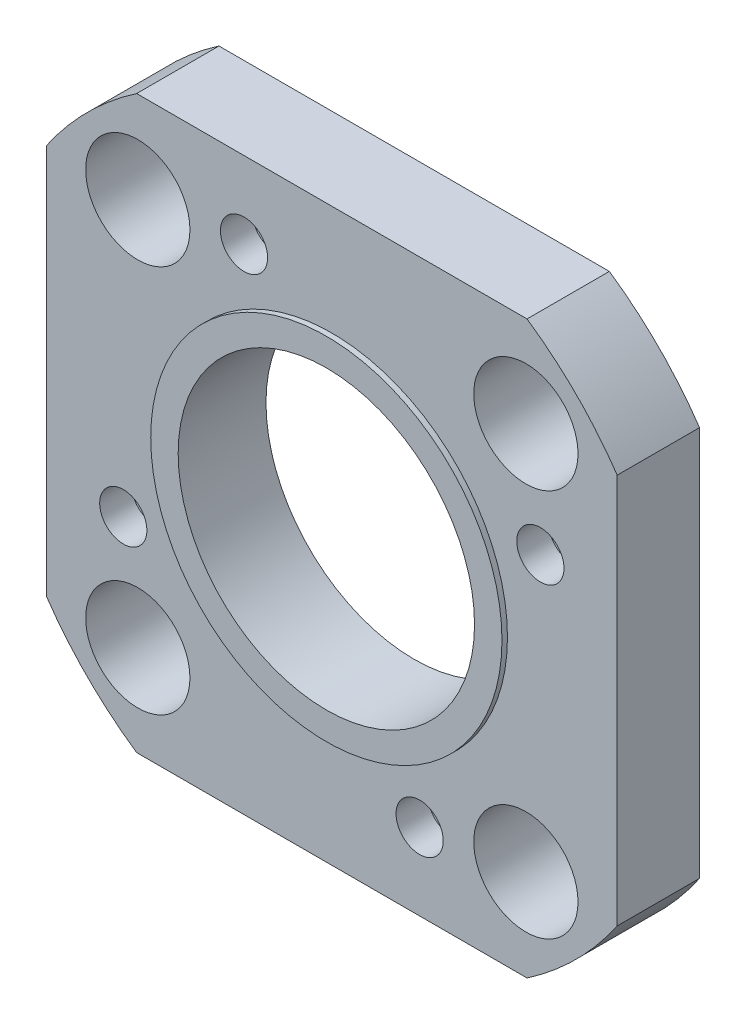
ISO-10303-21;
HEADER;
FILE_DESCRIPTION(('STEP AP214'),'2;1');
FILE_NAME('part.step','',(''),(''),'','','');
FILE_SCHEMA(('AUTOMOTIVE_DESIGN { 1 0 10303 214 1 1 1 1 }'));
ENDSEC;
DATA;
#1=APPLICATION_CONTEXT('core data for automotive mechanical design processes');
#2=APPLICATION_PROTOCOL_DEFINITION('international standard','automotive_design',2000,#1);
#3=PRODUCT_CONTEXT('',#1,'mechanical');
#4=PRODUCT('Part','Part','',(#3));
#5=PRODUCT_RELATED_PRODUCT_CATEGORY('part','',(#4));
#6=PRODUCT_DEFINITION_FORMATION('','',#4);
#7=PRODUCT_DEFINITION_CONTEXT('part definition',#1,'design');
#8=PRODUCT_DEFINITION('design','',#6,#7);
#9=PRODUCT_DEFINITION_SHAPE('','',#8);
#10=(LENGTH_UNIT() NAMED_UNIT(*) SI_UNIT(.MILLI.,.METRE.));
#11=(NAMED_UNIT(*) PLANE_ANGLE_UNIT() SI_UNIT($,.RADIAN.));
#12=(NAMED_UNIT(*) SI_UNIT($,.STERADIAN.) SOLID_ANGLE_UNIT());
#13=UNCERTAINTY_MEASURE_WITH_UNIT(LENGTH_MEASURE(1.E-05),#10,'distance_accuracy_value','');
#14=(GEOMETRIC_REPRESENTATION_CONTEXT(3) GLOBAL_UNCERTAINTY_ASSIGNED_CONTEXT((#13)) GLOBAL_UNIT_ASSIGNED_CONTEXT((#10,
#11,#12)) REPRESENTATION_CONTEXT('',''));
#15=CARTESIAN_POINT('',(0.,0.,0.));
#16=DIRECTION('',(0.,0.,1.));
#17=DIRECTION('',(1.,0.,0.));
#18=AXIS2_PLACEMENT_3D('',#15,#16,#17);
#19=CARTESIAN_POINT('',(19.,8.,0.));
#20=DIRECTION('',(0.,0.,1.));
#21=DIRECTION('',(-1.,0.,0.));
#22=AXIS2_PLACEMENT_3D('',#19,#20,#21);
#23=CYLINDRICAL_SURFACE('',#22,4.);
#24=CARTESIAN_POINT('',(19.,8.,0.));
#25=DIRECTION('',(0.,0.,-1.));
#26=DIRECTION('',(-1.,0.,0.));
#27=AXIS2_PLACEMENT_3D('',#24,#25,#26);
#28=CIRCLE('',#27,4.);
#29=CARTESIAN_POINT('',(23.,8.,0.));
#30=VERTEX_POINT('',#29);
#31=EDGE_CURVE('E170',#30,#30,#28,.T.);
#32=ORIENTED_EDGE('',*,*,#31,.T.);
#33=DIRECTION('',(0.,0.,1.));
#34=VECTOR('',#33,1.);
#35=CARTESIAN_POINT('',(23.,8.,0.));
#36=LINE('',#35,#34);
#37=CARTESIAN_POINT('',(23.,8.,4.6));
#38=VERTEX_POINT('',#37);
#39=EDGE_CURVE('E11',#30,#38,#36,.T.);
#40=ORIENTED_EDGE('',*,*,#39,.T.);
#41=CARTESIAN_POINT('',(19.,8.,4.6));
#42=DIRECTION('',(0.,0.,-1.));
#43=DIRECTION('',(-1.,0.,0.));
#44=AXIS2_PLACEMENT_3D('',#41,#42,#43);
#45=CIRCLE('',#44,4.);
#46=EDGE_CURVE('E27',#38,#38,#45,.T.);
#47=ORIENTED_EDGE('',*,*,#46,.F.);
#48=ORIENTED_EDGE('',*,*,#39,.F.);
#49=EDGE_LOOP('',(#32,#40,#47,#48));
#50=FACE_BOUND('',#49,.T.);
#51=ADVANCED_FACE('F17',(#50),#23,.F.);
#52=CARTESIAN_POINT('',(16.85,8.,4.6));
#53=DIRECTION('',(0.,0.,-1.));
#54=DIRECTION('',(0.,-1.,0.));
#55=AXIS2_PLACEMENT_3D('',#52,#53,#54);
#56=PLANE('',#55);
#57=CARTESIAN_POINT('',(19.,8.,4.6));
#58=DIRECTION('',(0.,0.,-1.));
#59=DIRECTION('',(-1.,0.,0.));
#60=AXIS2_PLACEMENT_3D('',#57,#58,#59);
#61=CIRCLE('',#60,2.15);
#62=CARTESIAN_POINT('',(21.15,8.,4.6));
#63=VERTEX_POINT('',#62);
#64=EDGE_CURVE('E145',#63,#63,#61,.T.);
#65=ORIENTED_EDGE('',*,*,#64,.F.);
#66=EDGE_LOOP('',(#65));
#67=FACE_BOUND('',#66,.T.);
#68=ORIENTED_EDGE('',*,*,#46,.T.);
#69=EDGE_LOOP('',(#68));
#70=FACE_BOUND('',#69,.T.);
#71=ADVANCED_FACE('F164',(#67,#70),#56,.T.);
#72=CARTESIAN_POINT('',(19.,8.,0.));
#73=DIRECTION('',(0.,0.,1.));
#74=DIRECTION('',(-1.,0.,0.));
#75=AXIS2_PLACEMENT_3D('',#72,#73,#74);
#76=CYLINDRICAL_SURFACE('',#75,2.15);
#77=ORIENTED_EDGE('',*,*,#64,.T.);
#78=DIRECTION('',(0.,0.,1.));
#79=VECTOR('',#78,1.);
#80=CARTESIAN_POINT('',(21.15,8.,0.));
#81=LINE('',#80,#79);
#82=CARTESIAN_POINT('',(21.15,8.,7.5));
#83=VERTEX_POINT('',#82);
#84=EDGE_CURVE('E158',#63,#83,#81,.T.);
#85=ORIENTED_EDGE('',*,*,#84,.T.);
#86=CARTESIAN_POINT('',(19.,8.,7.5));
#87=DIRECTION('',(0.,0.,-1.));
#88=DIRECTION('',(-1.,0.,0.));
#89=AXIS2_PLACEMENT_3D('',#86,#87,#88);
#90=CIRCLE('',#89,2.15);
#91=EDGE_CURVE('E382',#83,#83,#90,.T.);
#92=ORIENTED_EDGE('',*,*,#91,.F.);
#93=ORIENTED_EDGE('',*,*,#84,.F.);
#94=EDGE_LOOP('',(#77,#85,#92,#93));
#95=FACE_BOUND('',#94,.T.);
#96=ADVANCED_FACE('F535',(#95),#76,.F.);
#97=CARTESIAN_POINT('',(8.,-19.,0.));
#98=DIRECTION('',(0.,0.,1.));
#99=DIRECTION('',(-1.,0.,0.));
#100=AXIS2_PLACEMENT_3D('',#97,#98,#99);
#101=CYLINDRICAL_SURFACE('',#100,4.);
#102=CARTESIAN_POINT('',(8.,-19.,0.));
#103=DIRECTION('',(0.,0.,-1.));
#104=DIRECTION('',(-1.,0.,0.));
#105=AXIS2_PLACEMENT_3D('',#102,#103,#104);
#106=CIRCLE('',#105,4.);
#107=CARTESIAN_POINT('',(12.,-19.,0.));
#108=VERTEX_POINT('',#107);
#109=EDGE_CURVE('E142',#108,#108,#106,.T.);
#110=ORIENTED_EDGE('',*,*,#109,.T.);
#111=DIRECTION('',(0.,0.,1.));
#112=VECTOR('',#111,1.);
#113=CARTESIAN_POINT('',(12.,-19.,0.));
#114=LINE('',#113,#112);
#115=CARTESIAN_POINT('',(12.,-19.,4.6));
#116=VERTEX_POINT('',#115);
#117=EDGE_CURVE('E140',#108,#116,#114,.T.);
#118=ORIENTED_EDGE('',*,*,#117,.T.);
#119=CARTESIAN_POINT('',(8.,-19.,4.6));
#120=DIRECTION('',(0.,0.,-1.));
#121=DIRECTION('',(-1.,0.,0.));
#122=AXIS2_PLACEMENT_3D('',#119,#120,#121);
#123=CIRCLE('',#122,4.);
#124=EDGE_CURVE('E139',#116,#116,#123,.T.);
#125=ORIENTED_EDGE('',*,*,#124,.F.);
#126=ORIENTED_EDGE('',*,*,#117,.F.);
#127=EDGE_LOOP('',(#110,#118,#125,#126));
#128=FACE_BOUND('',#127,.T.);
#129=ADVANCED_FACE('F137',(#128),#101,.F.);
#130=CARTESIAN_POINT('',(5.85,-19.,4.6));
#131=DIRECTION('',(0.,0.,-1.));
#132=DIRECTION('',(0.,-1.,0.));
#133=AXIS2_PLACEMENT_3D('',#130,#131,#132);
#134=PLANE('',#133);
#135=CARTESIAN_POINT('',(8.,-19.,4.6));
#136=DIRECTION('',(0.,0.,-1.));
#137=DIRECTION('',(-1.,0.,0.));
#138=AXIS2_PLACEMENT_3D('',#135,#136,#137);
#139=CIRCLE('',#138,2.15);
#140=CARTESIAN_POINT('',(10.15,-19.,4.6));
#141=VERTEX_POINT('',#140);
#142=EDGE_CURVE('E152',#141,#141,#139,.T.);
#143=ORIENTED_EDGE('',*,*,#142,.F.);
#144=EDGE_LOOP('',(#143));
#145=FACE_BOUND('',#144,.T.);
#146=ORIENTED_EDGE('',*,*,#124,.T.);
#147=EDGE_LOOP('',(#146));
#148=FACE_BOUND('',#147,.T.);
#149=ADVANCED_FACE('F150',(#145,#148),#134,.T.);
#150=CARTESIAN_POINT('',(8.,-19.,0.));
#151=DIRECTION('',(0.,0.,1.));
#152=DIRECTION('',(-1.,0.,0.));
#153=AXIS2_PLACEMENT_3D('',#150,#151,#152);
#154=CYLINDRICAL_SURFACE('',#153,2.15);
#155=ORIENTED_EDGE('',*,*,#142,.T.);
#156=DIRECTION('',(0.,0.,1.));
#157=VECTOR('',#156,1.);
#158=CARTESIAN_POINT('',(10.15,-19.,0.));
#159=LINE('',#158,#157);
#160=CARTESIAN_POINT('',(10.15,-19.,7.5));
#161=VERTEX_POINT('',#160);
#162=EDGE_CURVE('E129',#141,#161,#159,.T.);
#163=ORIENTED_EDGE('',*,*,#162,.T.);
#164=CARTESIAN_POINT('',(8.,-19.,7.5));
#165=DIRECTION('',(0.,0.,-1.));
#166=DIRECTION('',(-1.,0.,0.));
#167=AXIS2_PLACEMENT_3D('',#164,#165,#166);
#168=CIRCLE('',#167,2.15);
#169=EDGE_CURVE('E357',#161,#161,#168,.T.);
#170=ORIENTED_EDGE('',*,*,#169,.F.);
#171=ORIENTED_EDGE('',*,*,#162,.F.);
#172=EDGE_LOOP('',(#155,#163,#170,#171));
#173=FACE_BOUND('',#172,.T.);
#174=ADVANCED_FACE('F519',(#173),#154,.F.);
#175=CARTESIAN_POINT('',(-19.,-8.,0.));
#176=DIRECTION('',(0.,0.,1.));
#177=DIRECTION('',(-1.,0.,0.));
#178=AXIS2_PLACEMENT_3D('',#175,#176,#177);
#179=CYLINDRICAL_SURFACE('',#178,4.);
#180=CARTESIAN_POINT('',(-19.,-8.,0.));
#181=DIRECTION('',(0.,0.,-1.));
#182=DIRECTION('',(-1.,0.,0.));
#183=AXIS2_PLACEMENT_3D('',#180,#181,#182);
#184=CIRCLE('',#183,4.);
#185=CARTESIAN_POINT('',(-15.,-8.,0.));
#186=VERTEX_POINT('',#185);
#187=EDGE_CURVE('E177',#186,#186,#184,.T.);
#188=ORIENTED_EDGE('',*,*,#187,.T.);
#189=DIRECTION('',(0.,0.,1.));
#190=VECTOR('',#189,1.);
#191=CARTESIAN_POINT('',(-15.,-8.,0.));
#192=LINE('',#191,#190);
#193=CARTESIAN_POINT('',(-15.,-8.,4.6));
#194=VERTEX_POINT('',#193);
#195=EDGE_CURVE('E248',#186,#194,#192,.T.);
#196=ORIENTED_EDGE('',*,*,#195,.T.);
#197=CARTESIAN_POINT('',(-19.,-8.,4.6));
#198=DIRECTION('',(0.,0.,-1.));
#199=DIRECTION('',(-1.,0.,0.));
#200=AXIS2_PLACEMENT_3D('',#197,#198,#199);
#201=CIRCLE('',#200,4.);
#202=EDGE_CURVE('E253',#194,#194,#201,.T.);
#203=ORIENTED_EDGE('',*,*,#202,.F.);
#204=ORIENTED_EDGE('',*,*,#195,.F.);
#205=EDGE_LOOP('',(#188,#196,#203,#204));
#206=FACE_BOUND('',#205,.T.);
#207=ADVANCED_FACE('F264',(#206),#179,.F.);
#208=CARTESIAN_POINT('',(-21.15,-8.,4.6));
#209=DIRECTION('',(0.,0.,-1.));
#210=DIRECTION('',(0.,-1.,0.));
#211=AXIS2_PLACEMENT_3D('',#208,#209,#210);
#212=PLANE('',#211);
#213=CARTESIAN_POINT('',(-19.,-8.,4.6));
#214=DIRECTION('',(0.,0.,-1.));
#215=DIRECTION('',(-1.,0.,0.));
#216=AXIS2_PLACEMENT_3D('',#213,#214,#215);
#217=CIRCLE('',#216,2.15);
#218=CARTESIAN_POINT('',(-16.85,-8.,4.6));
#219=VERTEX_POINT('',#218);
#220=EDGE_CURVE('E250',#219,#219,#217,.T.);
#221=ORIENTED_EDGE('',*,*,#220,.F.);
#222=EDGE_LOOP('',(#221));
#223=FACE_BOUND('',#222,.T.);
#224=ORIENTED_EDGE('',*,*,#202,.T.);
#225=EDGE_LOOP('',(#224));
#226=FACE_BOUND('',#225,.T.);
#227=ADVANCED_FACE('F263',(#223,#226),#212,.T.);
#228=CARTESIAN_POINT('',(-19.,-8.,0.));
#229=DIRECTION('',(0.,0.,1.));
#230=DIRECTION('',(-1.,0.,0.));
#231=AXIS2_PLACEMENT_3D('',#228,#229,#230);
#232=CYLINDRICAL_SURFACE('',#231,2.15);
#233=ORIENTED_EDGE('',*,*,#220,.T.);
#234=DIRECTION('',(0.,0.,1.));
#235=VECTOR('',#234,1.);
#236=CARTESIAN_POINT('',(-16.85,-8.,0.));
#237=LINE('',#236,#235);
#238=CARTESIAN_POINT('',(-16.85,-8.,7.5));
#239=VERTEX_POINT('',#238);
#240=EDGE_CURVE('E254',#219,#239,#237,.T.);
#241=ORIENTED_EDGE('',*,*,#240,.T.);
#242=CARTESIAN_POINT('',(-19.,-8.,7.5));
#243=DIRECTION('',(0.,0.,-1.));
#244=DIRECTION('',(-1.,0.,0.));
#245=AXIS2_PLACEMENT_3D('',#242,#243,#244);
#246=CIRCLE('',#245,2.15);
#247=EDGE_CURVE('E353',#239,#239,#246,.T.);
#248=ORIENTED_EDGE('',*,*,#247,.F.);
#249=ORIENTED_EDGE('',*,*,#240,.F.);
#250=EDGE_LOOP('',(#233,#241,#248,#249));
#251=FACE_BOUND('',#250,.T.);
#252=ADVANCED_FACE('F601',(#251),#232,.F.);
#253=CARTESIAN_POINT('',(-8.,19.,0.));
#254=DIRECTION('',(0.,0.,1.));
#255=DIRECTION('',(-1.,0.,0.));
#256=AXIS2_PLACEMENT_3D('',#253,#254,#255);
#257=CYLINDRICAL_SURFACE('',#256,4.);
#258=CARTESIAN_POINT('',(-8.,19.,0.));
#259=DIRECTION('',(0.,0.,-1.));
#260=DIRECTION('',(-1.,0.,0.));
#261=AXIS2_PLACEMENT_3D('',#258,#259,#260);
#262=CIRCLE('',#261,4.);
#263=CARTESIAN_POINT('',(-4.,19.,0.));
#264=VERTEX_POINT('',#263);
#265=EDGE_CURVE('E188',#264,#264,#262,.T.);
#266=ORIENTED_EDGE('',*,*,#265,.T.);
#267=DIRECTION('',(0.,0.,1.));
#268=VECTOR('',#267,1.);
#269=CARTESIAN_POINT('',(-4.,19.,0.));
#270=LINE('',#269,#268);
#271=CARTESIAN_POINT('',(-4.,19.,4.6));
#272=VERTEX_POINT('',#271);
#273=EDGE_CURVE('E243',#264,#272,#270,.T.);
#274=ORIENTED_EDGE('',*,*,#273,.T.);
#275=CARTESIAN_POINT('',(-8.,19.,4.6));
#276=DIRECTION('',(0.,0.,-1.));
#277=DIRECTION('',(-1.,0.,0.));
#278=AXIS2_PLACEMENT_3D('',#275,#276,#277);
#279=CIRCLE('',#278,4.);
#280=EDGE_CURVE('E239',#272,#272,#279,.T.);
#281=ORIENTED_EDGE('',*,*,#280,.F.);
#282=ORIENTED_EDGE('',*,*,#273,.F.);
#283=EDGE_LOOP('',(#266,#274,#281,#282));
#284=FACE_BOUND('',#283,.T.);
#285=ADVANCED_FACE('F608',(#284),#257,.F.);
#286=CARTESIAN_POINT('',(-10.15,19.,4.6));
#287=DIRECTION('',(0.,0.,-1.));
#288=DIRECTION('',(0.,-1.,0.));
#289=AXIS2_PLACEMENT_3D('',#286,#287,#288);
#290=PLANE('',#289);
#291=CARTESIAN_POINT('',(-8.,19.,4.6));
#292=DIRECTION('',(0.,0.,-1.));
#293=DIRECTION('',(-1.,0.,0.));
#294=AXIS2_PLACEMENT_3D('',#291,#292,#293);
#295=CIRCLE('',#294,2.15);
#296=CARTESIAN_POINT('',(-5.85,19.,4.6));
#297=VERTEX_POINT('',#296);
#298=EDGE_CURVE('E234',#297,#297,#295,.T.);
#299=ORIENTED_EDGE('',*,*,#298,.F.);
#300=EDGE_LOOP('',(#299));
#301=FACE_BOUND('',#300,.T.);
#302=ORIENTED_EDGE('',*,*,#280,.T.);
#303=EDGE_LOOP('',(#302));
#304=FACE_BOUND('',#303,.T.);
#305=ADVANCED_FACE('F616',(#301,#304),#290,.T.);
#306=CARTESIAN_POINT('',(-8.,19.,0.));
#307=DIRECTION('',(0.,0.,1.));
#308=DIRECTION('',(-1.,0.,0.));
#309=AXIS2_PLACEMENT_3D('',#306,#307,#308);
#310=CYLINDRICAL_SURFACE('',#309,2.15);
#311=ORIENTED_EDGE('',*,*,#298,.T.);
#312=DIRECTION('',(0.,0.,1.));
#313=VECTOR('',#312,1.);
#314=CARTESIAN_POINT('',(-5.85,19.,0.));
#315=LINE('',#314,#313);
#316=CARTESIAN_POINT('',(-5.85,19.,7.5));
#317=VERTEX_POINT('',#316);
#318=EDGE_CURVE('E236',#297,#317,#315,.T.);
#319=ORIENTED_EDGE('',*,*,#318,.T.);
#320=CARTESIAN_POINT('',(-8.,19.,7.5));
#321=DIRECTION('',(0.,0.,-1.));
#322=DIRECTION('',(-1.,0.,0.));
#323=AXIS2_PLACEMENT_3D('',#320,#321,#322);
#324=CIRCLE('',#323,2.15);
#325=EDGE_CURVE('E358',#317,#317,#324,.T.);
#326=ORIENTED_EDGE('',*,*,#325,.F.);
#327=ORIENTED_EDGE('',*,*,#318,.F.);
#328=EDGE_LOOP('',(#311,#319,#326,#327));
#329=FACE_BOUND('',#328,.T.);
#330=ADVANCED_FACE('F627',(#329),#310,.F.);
#331=CARTESIAN_POINT('',(-17.6776695296637,-17.6776695296637,7.5));
#332=DIRECTION('',(0.,0.,1.));
#333=DIRECTION('',(-1.,0.,0.));
#334=AXIS2_PLACEMENT_3D('',#331,#332,#333);
#335=CYLINDRICAL_SURFACE('',#334,4.75);
#336=CARTESIAN_POINT('',(-17.6776695296637,-17.6776695296637,0.));
#337=DIRECTION('',(0.,0.,1.));
#338=DIRECTION('',(1.,0.,0.));
#339=AXIS2_PLACEMENT_3D('',#336,#337,#338);
#340=CIRCLE('',#339,4.75);
#341=CARTESIAN_POINT('',(-12.9276695296637,-17.6776695296637,0.));
#342=VERTEX_POINT('',#341);
#343=EDGE_CURVE('E193',#342,#342,#340,.T.);
#344=ORIENTED_EDGE('',*,*,#343,.F.);
#345=DIRECTION('',(0.,0.,1.));
#346=VECTOR('',#345,1.);
#347=CARTESIAN_POINT('',(-12.9276695296637,-17.6776695296637,7.5));
#348=LINE('',#347,#346);
#349=CARTESIAN_POINT('',(-12.9276695296637,-17.6776695296637,7.5));
#350=VERTEX_POINT('',#349);
#351=EDGE_CURVE('E230',#342,#350,#348,.T.);
#352=ORIENTED_EDGE('',*,*,#351,.T.);
#353=CARTESIAN_POINT('',(-17.6776695296637,-17.6776695296637,7.5));
#354=DIRECTION('',(0.,0.,1.));
#355=DIRECTION('',(1.,0.,0.));
#356=AXIS2_PLACEMENT_3D('',#353,#354,#355);
#357=CIRCLE('',#356,4.75);
#358=EDGE_CURVE('E394',#350,#350,#357,.T.);
#359=ORIENTED_EDGE('',*,*,#358,.T.);
#360=ORIENTED_EDGE('',*,*,#351,.F.);
#361=EDGE_LOOP('',(#344,#352,#359,#360));
#362=FACE_BOUND('',#361,.T.);
#363=ADVANCED_FACE('F637',(#362),#335,.F.);
#364=CARTESIAN_POINT('',(17.6776695296637,-17.6776695296637,7.5));
#365=DIRECTION('',(0.,0.,1.));
#366=DIRECTION('',(-1.,0.,0.));
#367=AXIS2_PLACEMENT_3D('',#364,#365,#366);
#368=CYLINDRICAL_SURFACE('',#367,4.75);
#369=CARTESIAN_POINT('',(17.6776695296637,-17.6776695296637,0.));
#370=DIRECTION('',(0.,0.,1.));
#371=DIRECTION('',(1.,0.,0.));
#372=AXIS2_PLACEMENT_3D('',#369,#370,#371);
#373=CIRCLE('',#372,4.75);
#374=CARTESIAN_POINT('',(22.4276695296637,-17.6776695296637,0.));
#375=VERTEX_POINT('',#374);
#376=EDGE_CURVE('E197',#375,#375,#373,.T.);
#377=ORIENTED_EDGE('',*,*,#376,.F.);
#378=DIRECTION('',(0.,0.,1.));
#379=VECTOR('',#378,1.);
#380=CARTESIAN_POINT('',(22.4276695296637,-17.6776695296637,7.5));
#381=LINE('',#380,#379);
#382=CARTESIAN_POINT('',(22.4276695296637,-17.6776695296637,7.5));
#383=VERTEX_POINT('',#382);
#384=EDGE_CURVE('E227',#375,#383,#381,.T.);
#385=ORIENTED_EDGE('',*,*,#384,.T.);
#386=CARTESIAN_POINT('',(17.6776695296637,-17.6776695296637,7.5));
#387=DIRECTION('',(0.,0.,1.));
#388=DIRECTION('',(1.,0.,0.));
#389=AXIS2_PLACEMENT_3D('',#386,#387,#388);
#390=CIRCLE('',#389,4.75);
#391=EDGE_CURVE('E400',#383,#383,#390,.T.);
#392=ORIENTED_EDGE('',*,*,#391,.T.);
#393=ORIENTED_EDGE('',*,*,#384,.F.);
#394=EDGE_LOOP('',(#377,#385,#392,#393));
#395=FACE_BOUND('',#394,.T.);
#396=ADVANCED_FACE('F646',(#395),#368,.F.);
#397=CARTESIAN_POINT('',(0.,0.,-50.));
#398=DIRECTION('',(0.,0.,1.));
#399=DIRECTION('',(-1.,0.,0.));
#400=AXIS2_PLACEMENT_3D('',#397,#398,#399);
#401=CYLINDRICAL_SURFACE('',#400,16.);
#402=CARTESIAN_POINT('',(0.,0.,8.));
#403=DIRECTION('',(0.,0.,-1.));
#404=DIRECTION('',(-1.,0.,0.));
#405=AXIS2_PLACEMENT_3D('',#402,#403,#404);
#406=CIRCLE('',#405,16.);
#407=CARTESIAN_POINT('',(16.,0.,8.));
#408=VERTEX_POINT('',#407);
#409=EDGE_CURVE('E219',#408,#408,#406,.T.);
#410=ORIENTED_EDGE('',*,*,#409,.T.);
#411=DIRECTION('',(0.,0.,-1.));
#412=VECTOR('',#411,1.);
#413=CARTESIAN_POINT('',(16.,0.,-50.));
#414=LINE('',#413,#412);
#415=CARTESIAN_POINT('',(16.,0.,7.5));
#416=VERTEX_POINT('',#415);
#417=EDGE_CURVE('E221',#408,#416,#414,.T.);
#418=ORIENTED_EDGE('',*,*,#417,.T.);
#419=CARTESIAN_POINT('',(0.,0.,7.5));
#420=DIRECTION('',(0.,0.,1.));
#421=DIRECTION('',(1.,0.,0.));
#422=AXIS2_PLACEMENT_3D('',#419,#420,#421);
#423=CIRCLE('',#422,16.);
#424=EDGE_CURVE('E298',#416,#416,#423,.T.);
#425=ORIENTED_EDGE('',*,*,#424,.T.);
#426=ORIENTED_EDGE('',*,*,#417,.F.);
#427=EDGE_LOOP('',(#410,#418,#425,#426));
#428=FACE_BOUND('',#427,.T.);
#429=ADVANCED_FACE('F654',(#428),#401,.T.);
#430=CARTESIAN_POINT('',(0.,16.,8.));
#431=DIRECTION('',(0.,0.,1.));
#432=DIRECTION('',(1.,0.,0.));
#433=AXIS2_PLACEMENT_3D('',#430,#431,#432);
#434=PLANE('',#433);
#435=CARTESIAN_POINT('',(0.,0.,8.));
#436=DIRECTION('',(0.,0.,-1.));
#437=DIRECTION('',(-1.,0.,0.));
#438=AXIS2_PLACEMENT_3D('',#435,#436,#437);
#439=CIRCLE('',#438,13.5);
#440=CARTESIAN_POINT('',(13.5,0.,8.));
#441=VERTEX_POINT('',#440);
#442=EDGE_CURVE('E211',#441,#441,#439,.T.);
#443=ORIENTED_EDGE('',*,*,#442,.T.);
#444=EDGE_LOOP('',(#443));
#445=FACE_BOUND('',#444,.T.);
#446=ORIENTED_EDGE('',*,*,#409,.F.);
#447=EDGE_LOOP('',(#446));
#448=FACE_BOUND('',#447,.T.);
#449=ADVANCED_FACE('F661',(#445,#448),#434,.T.);
#450=CARTESIAN_POINT('',(17.6776695296637,17.6776695296637,7.5));
#451=DIRECTION('',(0.,0.,1.));
#452=DIRECTION('',(-1.,0.,0.));
#453=AXIS2_PLACEMENT_3D('',#450,#451,#452);
#454=CYLINDRICAL_SURFACE('',#453,4.75);
#455=CARTESIAN_POINT('',(17.6776695296637,17.6776695296637,0.));
#456=DIRECTION('',(0.,0.,1.));
#457=DIRECTION('',(1.,0.,0.));
#458=AXIS2_PLACEMENT_3D('',#455,#456,#457);
#459=CIRCLE('',#458,4.75);
#460=CARTESIAN_POINT('',(22.4276695296637,17.6776695296637,0.));
#461=VERTEX_POINT('',#460);
#462=EDGE_CURVE('E201',#461,#461,#459,.T.);
#463=ORIENTED_EDGE('',*,*,#462,.F.);
#464=DIRECTION('',(0.,0.,1.));
#465=VECTOR('',#464,1.);
#466=CARTESIAN_POINT('',(22.4276695296637,17.6776695296637,7.5));
#467=LINE('',#466,#465);
#468=CARTESIAN_POINT('',(22.4276695296637,17.6776695296637,7.5));
#469=VERTEX_POINT('',#468);
#470=EDGE_CURVE('E220',#461,#469,#467,.T.);
#471=ORIENTED_EDGE('',*,*,#470,.T.);
#472=CARTESIAN_POINT('',(17.6776695296637,17.6776695296637,7.5));
#473=DIRECTION('',(0.,0.,1.));
#474=DIRECTION('',(1.,0.,0.));
#475=AXIS2_PLACEMENT_3D('',#472,#473,#474);
#476=CIRCLE('',#475,4.75);
#477=EDGE_CURVE('E405',#469,#469,#476,.T.);
#478=ORIENTED_EDGE('',*,*,#477,.T.);
#479=ORIENTED_EDGE('',*,*,#470,.F.);
#480=EDGE_LOOP('',(#463,#471,#478,#479));
#481=FACE_BOUND('',#480,.T.);
#482=ADVANCED_FACE('F462',(#481),#454,.F.);
#483=CARTESIAN_POINT('',(-17.6776695296637,17.6776695296637,7.5));
#484=DIRECTION('',(0.,0.,1.));
#485=DIRECTION('',(-1.,0.,0.));
#486=AXIS2_PLACEMENT_3D('',#483,#484,#485);
#487=CYLINDRICAL_SURFACE('',#486,4.75);
#488=CARTESIAN_POINT('',(-17.6776695296637,17.6776695296637,0.));
#489=DIRECTION('',(0.,0.,1.));
#490=DIRECTION('',(1.,0.,0.));
#491=AXIS2_PLACEMENT_3D('',#488,#489,#490);
#492=CIRCLE('',#491,4.75);
#493=CARTESIAN_POINT('',(-12.9276695296637,17.6776695296637,0.));
#494=VERTEX_POINT('',#493);
#495=EDGE_CURVE('E196',#494,#494,#492,.T.);
#496=ORIENTED_EDGE('',*,*,#495,.F.);
#497=DIRECTION('',(0.,0.,1.));
#498=VECTOR('',#497,1.);
#499=CARTESIAN_POINT('',(-12.9276695296637,17.6776695296637,7.5));
#500=LINE('',#499,#498);
#501=CARTESIAN_POINT('',(-12.9276695296637,17.6776695296637,7.5));
#502=VERTEX_POINT('',#501);
#503=EDGE_CURVE('E212',#494,#502,#500,.T.);
#504=ORIENTED_EDGE('',*,*,#503,.T.);
#505=CARTESIAN_POINT('',(-17.6776695296637,17.6776695296637,7.5));
#506=DIRECTION('',(0.,0.,1.));
#507=DIRECTION('',(1.,0.,0.));
#508=AXIS2_PLACEMENT_3D('',#505,#506,#507);
#509=CIRCLE('',#508,4.75);
#510=EDGE_CURVE('E404',#502,#502,#509,.T.);
#511=ORIENTED_EDGE('',*,*,#510,.T.);
#512=ORIENTED_EDGE('',*,*,#503,.F.);
#513=EDGE_LOOP('',(#496,#504,#511,#512));
#514=FACE_BOUND('',#513,.T.);
#515=ADVANCED_FACE('F685',(#514),#487,.F.);
#516=CARTESIAN_POINT('',(26.,26.,7.5));
#517=DIRECTION('',(0.,-1.,0.));
#518=DIRECTION('',(0.,0.,-1.));
#519=AXIS2_PLACEMENT_3D('',#516,#517,#518);
#520=PLANE('',#519);
#521=DIRECTION('',(-1.,0.,0.));
#522=VECTOR('',#521,1.);
#523=CARTESIAN_POINT('',(26.,26.,0.));
#524=LINE('',#523,#522);
#525=CARTESIAN_POINT('',(17.7834192437787,26.,0.));
#526=VERTEX_POINT('',#525);
#527=CARTESIAN_POINT('',(-17.7834192437787,26.,0.));
#528=VERTEX_POINT('',#527);
#529=EDGE_CURVE('E168',#526,#528,#524,.T.);
#530=ORIENTED_EDGE('',*,*,#529,.T.);
#531=DIRECTION('',(0.,0.,1.));
#532=VECTOR('',#531,1.);
#533=CARTESIAN_POINT('',(-17.7834192437787,26.,7.5));
#534=LINE('',#533,#532);
#535=CARTESIAN_POINT('',(-17.7834192437787,26.,7.5));
#536=VERTEX_POINT('',#535);
#537=EDGE_CURVE('E328',#528,#536,#534,.T.);
#538=ORIENTED_EDGE('',*,*,#537,.T.);
#539=DIRECTION('',(-1.,0.,0.));
#540=VECTOR('',#539,1.);
#541=CARTESIAN_POINT('',(26.,26.,7.5));
#542=LINE('',#541,#540);
#543=CARTESIAN_POINT('',(17.7834192437787,26.,7.5));
#544=VERTEX_POINT('',#543);
#545=EDGE_CURVE('E371',#544,#536,#542,.T.);
#546=ORIENTED_EDGE('',*,*,#545,.F.);
#547=DIRECTION('',(0.,0.,-1.));
#548=VECTOR('',#547,1.);
#549=CARTESIAN_POINT('',(17.7834192437787,26.,7.5));
#550=LINE('',#549,#548);
#551=EDGE_CURVE('E336',#544,#526,#550,.T.);
#552=ORIENTED_EDGE('',*,*,#551,.T.);
#553=EDGE_LOOP('',(#530,#538,#546,#552));
#554=FACE_BOUND('',#553,.T.);
#555=ADVANCED_FACE('F678',(#554),#520,.F.);
#556=CARTESIAN_POINT('',(-26.,26.,7.5));
#557=DIRECTION('',(1.,0.,0.));
#558=DIRECTION('',(0.,1.,0.));
#559=AXIS2_PLACEMENT_3D('',#556,#557,#558);
#560=PLANE('',#559);
#561=DIRECTION('',(0.,-1.,0.));
#562=VECTOR('',#561,1.);
#563=CARTESIAN_POINT('',(-26.,26.,0.));
#564=LINE('',#563,#562);
#565=CARTESIAN_POINT('',(-26.,17.7834192437787,0.));
#566=VERTEX_POINT('',#565);
#567=CARTESIAN_POINT('',(-26.,-17.7834192437787,0.));
#568=VERTEX_POINT('',#567);
#569=EDGE_CURVE('E176',#566,#568,#564,.T.);
#570=ORIENTED_EDGE('',*,*,#569,.T.);
#571=DIRECTION('',(0.,0.,1.));
#572=VECTOR('',#571,1.);
#573=CARTESIAN_POINT('',(-26.,-17.7834192437787,7.5));
#574=LINE('',#573,#572);
#575=CARTESIAN_POINT('',(-26.,-17.7834192437787,7.5));
#576=VERTEX_POINT('',#575);
#577=EDGE_CURVE('E317',#568,#576,#574,.T.);
#578=ORIENTED_EDGE('',*,*,#577,.T.);
#579=DIRECTION('',(0.,-1.,0.));
#580=VECTOR('',#579,1.);
#581=CARTESIAN_POINT('',(-26.,26.,7.5));
#582=LINE('',#581,#580);
#583=CARTESIAN_POINT('',(-26.,17.7834192437787,7.5));
#584=VERTEX_POINT('',#583);
#585=EDGE_CURVE('E375',#584,#576,#582,.T.);
#586=ORIENTED_EDGE('',*,*,#585,.F.);
#587=DIRECTION('',(0.,0.,-1.));
#588=VECTOR('',#587,1.);
#589=CARTESIAN_POINT('',(-26.,17.7834192437787,7.5));
#590=LINE('',#589,#588);
#591=EDGE_CURVE('E350',#584,#566,#590,.T.);
#592=ORIENTED_EDGE('',*,*,#591,.T.);
#593=EDGE_LOOP('',(#570,#578,#586,#592));
#594=FACE_BOUND('',#593,.T.);
#595=ADVANCED_FACE('F425',(#594),#560,.F.);
#596=CARTESIAN_POINT('',(-26.,-26.,7.5));
#597=DIRECTION('',(0.,1.,0.));
#598=DIRECTION('',(1.,0.,0.));
#599=AXIS2_PLACEMENT_3D('',#596,#597,#598);
#600=PLANE('',#599);
#601=DIRECTION('',(1.,0.,0.));
#602=VECTOR('',#601,1.);
#603=CARTESIAN_POINT('',(-26.,-26.,0.));
#604=LINE('',#603,#602);
#605=CARTESIAN_POINT('',(-17.7834192437787,-26.,0.));
#606=VERTEX_POINT('',#605);
#607=CARTESIAN_POINT('',(17.7834192437787,-26.,0.));
#608=VERTEX_POINT('',#607);
#609=EDGE_CURVE('E297',#606,#608,#604,.T.);
#610=ORIENTED_EDGE('',*,*,#609,.T.);
#611=DIRECTION('',(0.,0.,1.));
#612=VECTOR('',#611,1.);
#613=CARTESIAN_POINT('',(17.7834192437787,-26.,7.5));
#614=LINE('',#613,#612);
#615=CARTESIAN_POINT('',(17.7834192437787,-26.,7.5));
#616=VERTEX_POINT('',#615);
#617=EDGE_CURVE('E320',#608,#616,#614,.T.);
#618=ORIENTED_EDGE('',*,*,#617,.T.);
#619=DIRECTION('',(1.,0.,0.));
#620=VECTOR('',#619,1.);
#621=CARTESIAN_POINT('',(-26.,-26.,7.5));
#622=LINE('',#621,#620);
#623=CARTESIAN_POINT('',(-17.7834192437787,-26.,7.5));
#624=VERTEX_POINT('',#623);
#625=EDGE_CURVE('E376',#624,#616,#622,.T.);
#626=ORIENTED_EDGE('',*,*,#625,.F.);
#627=DIRECTION('',(0.,0.,-1.));
#628=VECTOR('',#627,1.);
#629=CARTESIAN_POINT('',(-17.7834192437787,-26.,7.5));
#630=LINE('',#629,#628);
#631=EDGE_CURVE('E442',#624,#606,#630,.T.);
#632=ORIENTED_EDGE('',*,*,#631,.T.);
#633=EDGE_LOOP('',(#610,#618,#626,#632));
#634=FACE_BOUND('',#633,.T.);
#635=ADVANCED_FACE('F688',(#634),#600,.F.);
#636=CARTESIAN_POINT('',(26.,-26.,7.5));
#637=DIRECTION('',(-1.,0.,0.));
#638=DIRECTION('',(0.,0.,1.));
#639=AXIS2_PLACEMENT_3D('',#636,#637,#638);
#640=PLANE('',#639);
#641=DIRECTION('',(0.,1.,0.));
#642=VECTOR('',#641,1.);
#643=CARTESIAN_POINT('',(26.,-26.,0.));
#644=LINE('',#643,#642);
#645=CARTESIAN_POINT('',(26.,-17.7834192437787,0.));
#646=VERTEX_POINT('',#645);
#647=CARTESIAN_POINT('',(26.,17.7834192437787,0.));
#648=VERTEX_POINT('',#647);
#649=EDGE_CURVE('E281',#646,#648,#644,.T.);
#650=ORIENTED_EDGE('',*,*,#649,.T.);
#651=DIRECTION('',(0.,0.,1.));
#652=VECTOR('',#651,1.);
#653=CARTESIAN_POINT('',(26.,17.7834192437787,7.5));
#654=LINE('',#653,#652);
#655=CARTESIAN_POINT('',(26.,17.7834192437787,7.5));
#656=VERTEX_POINT('',#655);
#657=EDGE_CURVE('E332',#648,#656,#654,.T.);
#658=ORIENTED_EDGE('',*,*,#657,.T.);
#659=DIRECTION('',(0.,1.,0.));
#660=VECTOR('',#659,1.);
#661=CARTESIAN_POINT('',(26.,-26.,7.5));
#662=LINE('',#661,#660);
#663=CARTESIAN_POINT('',(26.,-17.7834192437787,7.5));
#664=VERTEX_POINT('',#663);
#665=EDGE_CURVE('E307',#664,#656,#662,.T.);
#666=ORIENTED_EDGE('',*,*,#665,.F.);
#667=DIRECTION('',(0.,0.,-1.));
#668=VECTOR('',#667,1.);
#669=CARTESIAN_POINT('',(26.,-17.7834192437787,7.5));
#670=LINE('',#669,#668);
#671=EDGE_CURVE('E303',#664,#646,#670,.T.);
#672=ORIENTED_EDGE('',*,*,#671,.T.);
#673=EDGE_LOOP('',(#650,#658,#666,#672));
#674=FACE_BOUND('',#673,.T.);
#675=ADVANCED_FACE('F302',(#674),#640,.F.);
#676=CARTESIAN_POINT('',(0.,0.,7.5));
#677=DIRECTION('',(0.,0.,1.));
#678=DIRECTION('',(-1.,0.,0.));
#679=AXIS2_PLACEMENT_3D('',#676,#677,#678);
#680=CYLINDRICAL_SURFACE('',#679,13.5);
#681=CARTESIAN_POINT('',(0.,0.,0.));
#682=DIRECTION('',(0.,0.,1.));
#683=DIRECTION('',(1.,0.,0.));
#684=AXIS2_PLACEMENT_3D('',#681,#682,#683);
#685=CIRCLE('',#684,13.5);
#686=CARTESIAN_POINT('',(13.5,0.,0.));
#687=VERTEX_POINT('',#686);
#688=EDGE_CURVE('E205',#687,#687,#685,.T.);
#689=ORIENTED_EDGE('',*,*,#688,.F.);
#690=DIRECTION('',(0.,0.,1.));
#691=VECTOR('',#690,1.);
#692=CARTESIAN_POINT('',(13.5,0.,7.5));
#693=LINE('',#692,#691);
#694=EDGE_CURVE('E210',#687,#441,#693,.T.);
#695=ORIENTED_EDGE('',*,*,#694,.T.);
#696=ORIENTED_EDGE('',*,*,#442,.F.);
#697=ORIENTED_EDGE('',*,*,#694,.F.);
#698=EDGE_LOOP('',(#689,#695,#696,#697));
#699=FACE_BOUND('',#698,.T.);
#700=ADVANCED_FACE('F275',(#699),#680,.F.);
#701=CARTESIAN_POINT('',(0.,0.,0.));
#702=DIRECTION('',(0.,0.,1.));
#703=DIRECTION('',(1.,0.,0.));
#704=AXIS2_PLACEMENT_3D('',#701,#702,#703);
#705=PLANE('',#704);
#706=ORIENTED_EDGE('',*,*,#688,.T.);
#707=EDGE_LOOP('',(#706));
#708=FACE_BOUND('',#707,.T.);
#709=ORIENTED_EDGE('',*,*,#495,.T.);
#710=EDGE_LOOP('',(#709));
#711=FACE_BOUND('',#710,.T.);
#712=ORIENTED_EDGE('',*,*,#462,.T.);
#713=EDGE_LOOP('',(#712));
#714=FACE_BOUND('',#713,.T.);
#715=ORIENTED_EDGE('',*,*,#376,.T.);
#716=EDGE_LOOP('',(#715));
#717=FACE_BOUND('',#716,.T.);
#718=ORIENTED_EDGE('',*,*,#343,.T.);
#719=EDGE_LOOP('',(#718));
#720=FACE_BOUND('',#719,.T.);
#721=ORIENTED_EDGE('',*,*,#265,.F.);
#722=EDGE_LOOP('',(#721));
#723=FACE_BOUND('',#722,.T.);
#724=ORIENTED_EDGE('',*,*,#187,.F.);
#725=EDGE_LOOP('',(#724));
#726=FACE_BOUND('',#725,.T.);
#727=ORIENTED_EDGE('',*,*,#109,.F.);
#728=EDGE_LOOP('',(#727));
#729=FACE_BOUND('',#728,.T.);
#730=ORIENTED_EDGE('',*,*,#31,.F.);
#731=EDGE_LOOP('',(#730));
#732=FACE_BOUND('',#731,.T.);
#733=ORIENTED_EDGE('',*,*,#649,.F.);
#734=CARTESIAN_POINT('',(0.,0.,0.));
#735=DIRECTION('',(0.,0.,-1.));
#736=DIRECTION('',(1.,0.,0.));
#737=AXIS2_PLACEMENT_3D('',#734,#735,#736);
#738=CIRCLE('',#737,31.5);
#739=EDGE_CURVE('E287',#646,#608,#738,.T.);
#740=ORIENTED_EDGE('',*,*,#739,.T.);
#741=ORIENTED_EDGE('',*,*,#609,.F.);
#742=CARTESIAN_POINT('',(0.,0.,0.));
#743=DIRECTION('',(0.,0.,-1.));
#744=DIRECTION('',(1.,0.,0.));
#745=AXIS2_PLACEMENT_3D('',#742,#743,#744);
#746=CIRCLE('',#745,31.5);
#747=EDGE_CURVE('E440',#606,#568,#746,.T.);
#748=ORIENTED_EDGE('',*,*,#747,.T.);
#749=ORIENTED_EDGE('',*,*,#569,.F.);
#750=CARTESIAN_POINT('',(0.,0.,0.));
#751=DIRECTION('',(0.,0.,-1.));
#752=DIRECTION('',(1.,0.,0.));
#753=AXIS2_PLACEMENT_3D('',#750,#751,#752);
#754=CIRCLE('',#753,31.5);
#755=EDGE_CURVE('E340',#566,#528,#754,.T.);
#756=ORIENTED_EDGE('',*,*,#755,.T.);
#757=ORIENTED_EDGE('',*,*,#529,.F.);
#758=CARTESIAN_POINT('',(0.,0.,0.));
#759=DIRECTION('',(0.,0.,1.));
#760=DIRECTION('',(1.,0.,0.));
#761=AXIS2_PLACEMENT_3D('',#758,#759,#760);
#762=CIRCLE('',#761,31.5);
#763=EDGE_CURVE('E288',#648,#526,#762,.T.);
#764=ORIENTED_EDGE('',*,*,#763,.F.);
#765=EDGE_LOOP('',(#733,#740,#741,#748,#749,#756,#757,#764));
#766=FACE_BOUND('',#765,.T.);
#767=ADVANCED_FACE('F268',(#708,#711,#714,#717,#720,#723,#726,#729,#732,#766),#705,.F.);
#768=CARTESIAN_POINT('',(0.,0.,7.5));
#769=DIRECTION('',(0.,0.,1.));
#770=DIRECTION('',(1.,0.,0.));
#771=AXIS2_PLACEMENT_3D('',#768,#769,#770);
#772=PLANE('',#771);
#773=ORIENTED_EDGE('',*,*,#424,.F.);
#774=EDGE_LOOP('',(#773));
#775=FACE_BOUND('',#774,.T.);
#776=ORIENTED_EDGE('',*,*,#510,.F.);
#777=EDGE_LOOP('',(#776));
#778=FACE_BOUND('',#777,.T.);
#779=ORIENTED_EDGE('',*,*,#477,.F.);
#780=EDGE_LOOP('',(#779));
#781=FACE_BOUND('',#780,.T.);
#782=ORIENTED_EDGE('',*,*,#391,.F.);
#783=EDGE_LOOP('',(#782));
#784=FACE_BOUND('',#783,.T.);
#785=ORIENTED_EDGE('',*,*,#358,.F.);
#786=EDGE_LOOP('',(#785));
#787=FACE_BOUND('',#786,.T.);
#788=ORIENTED_EDGE('',*,*,#325,.T.);
#789=EDGE_LOOP('',(#788));
#790=FACE_BOUND('',#789,.T.);
#791=ORIENTED_EDGE('',*,*,#247,.T.);
#792=EDGE_LOOP('',(#791));
#793=FACE_BOUND('',#792,.T.);
#794=ORIENTED_EDGE('',*,*,#169,.T.);
#795=EDGE_LOOP('',(#794));
#796=FACE_BOUND('',#795,.T.);
#797=ORIENTED_EDGE('',*,*,#91,.T.);
#798=EDGE_LOOP('',(#797));
#799=FACE_BOUND('',#798,.T.);
#800=CARTESIAN_POINT('',(0.,0.,7.5));
#801=DIRECTION('',(0.,0.,1.));
#802=DIRECTION('',(1.,0.,0.));
#803=AXIS2_PLACEMENT_3D('',#800,#801,#802);
#804=CIRCLE('',#803,31.5);
#805=EDGE_CURVE('E315',#616,#664,#804,.T.);
#806=ORIENTED_EDGE('',*,*,#805,.T.);
#807=ORIENTED_EDGE('',*,*,#665,.T.);
#808=CARTESIAN_POINT('',(0.,0.,7.5));
#809=DIRECTION('',(0.,0.,1.));
#810=DIRECTION('',(1.,0.,0.));
#811=AXIS2_PLACEMENT_3D('',#808,#809,#810);
#812=CIRCLE('',#811,31.5);
#813=EDGE_CURVE('E331',#656,#544,#812,.T.);
#814=ORIENTED_EDGE('',*,*,#813,.T.);
#815=ORIENTED_EDGE('',*,*,#545,.T.);
#816=CARTESIAN_POINT('',(0.,0.,7.5));
#817=DIRECTION('',(0.,0.,1.));
#818=DIRECTION('',(1.,0.,0.));
#819=AXIS2_PLACEMENT_3D('',#816,#817,#818);
#820=CIRCLE('',#819,31.5);
#821=EDGE_CURVE('E349',#536,#584,#820,.T.);
#822=ORIENTED_EDGE('',*,*,#821,.T.);
#823=ORIENTED_EDGE('',*,*,#585,.T.);
#824=CARTESIAN_POINT('',(0.,0.,7.5));
#825=DIRECTION('',(0.,0.,1.));
#826=DIRECTION('',(1.,0.,0.));
#827=AXIS2_PLACEMENT_3D('',#824,#825,#826);
#828=CIRCLE('',#827,31.5);
#829=EDGE_CURVE('E324',#576,#624,#828,.T.);
#830=ORIENTED_EDGE('',*,*,#829,.T.);
#831=ORIENTED_EDGE('',*,*,#625,.T.);
#832=EDGE_LOOP('',(#806,#807,#814,#815,#822,#823,#830,#831));
#833=FACE_BOUND('',#832,.T.);
#834=ADVANCED_FACE('F271',(#775,#778,#781,#784,#787,#790,#793,#796,#799,#833),#772,.T.);
#835=CARTESIAN_POINT('',(0.,0.,7.5));
#836=DIRECTION('',(0.,0.,1.));
#837=DIRECTION('',(-1.,0.,0.));
#838=AXIS2_PLACEMENT_3D('',#835,#836,#837);
#839=CYLINDRICAL_SURFACE('',#838,31.5);
#840=ORIENTED_EDGE('',*,*,#813,.F.);
#841=ORIENTED_EDGE('',*,*,#657,.F.);
#842=ORIENTED_EDGE('',*,*,#763,.T.);
#843=ORIENTED_EDGE('',*,*,#551,.F.);
#844=EDGE_LOOP('',(#840,#841,#842,#843));
#845=FACE_BOUND('',#844,.T.);
#846=ADVANCED_FACE('F468',(#845),#839,.T.);
#847=CARTESIAN_POINT('',(0.,0.,7.5));
#848=DIRECTION('',(0.,0.,1.));
#849=DIRECTION('',(-1.,0.,0.));
#850=AXIS2_PLACEMENT_3D('',#847,#848,#849);
#851=CYLINDRICAL_SURFACE('',#850,31.5);
#852=ORIENTED_EDGE('',*,*,#755,.F.);
#853=ORIENTED_EDGE('',*,*,#591,.F.);
#854=ORIENTED_EDGE('',*,*,#821,.F.);
#855=ORIENTED_EDGE('',*,*,#537,.F.);
#856=EDGE_LOOP('',(#852,#853,#854,#855));
#857=FACE_BOUND('',#856,.T.);
#858=ADVANCED_FACE('F747',(#857),#851,.T.);
#859=CARTESIAN_POINT('',(0.,0.,7.5));
#860=DIRECTION('',(0.,0.,1.));
#861=DIRECTION('',(-1.,0.,0.));
#862=AXIS2_PLACEMENT_3D('',#859,#860,#861);
#863=CYLINDRICAL_SURFACE('',#862,31.5);
#864=ORIENTED_EDGE('',*,*,#739,.F.);
#865=ORIENTED_EDGE('',*,*,#671,.F.);
#866=ORIENTED_EDGE('',*,*,#805,.F.);
#867=ORIENTED_EDGE('',*,*,#617,.F.);
#868=EDGE_LOOP('',(#864,#865,#866,#867));
#869=FACE_BOUND('',#868,.T.);
#870=ADVANCED_FACE('F312',(#869),#863,.T.);
#871=CARTESIAN_POINT('',(0.,0.,7.5));
#872=DIRECTION('',(0.,0.,1.));
#873=DIRECTION('',(-1.,0.,0.));
#874=AXIS2_PLACEMENT_3D('',#871,#872,#873);
#875=CYLINDRICAL_SURFACE('',#874,31.5);
#876=ORIENTED_EDGE('',*,*,#747,.F.);
#877=ORIENTED_EDGE('',*,*,#631,.F.);
#878=ORIENTED_EDGE('',*,*,#829,.F.);
#879=ORIENTED_EDGE('',*,*,#577,.F.);
#880=EDGE_LOOP('',(#876,#877,#878,#879));
#881=FACE_BOUND('',#880,.T.);
#882=ADVANCED_FACE('F434',(#881),#875,.T.);
#883=CLOSED_SHELL('',(#51,#71,#96,#129,#149,#174,#207,#227,#252,#285,#305,#330,#363,#396,#429,
#449,#482,#515,#555,#595,#635,#675,#700,#767,#834,#846,#858,#870,#882));
#884=MANIFOLD_SOLID_BREP('B1',#883);
#885=ADVANCED_BREP_SHAPE_REPRESENTATION('',(#18,#884),#14);
#886=SHAPE_DEFINITION_REPRESENTATION(#9,#885);
ENDSEC;
END-ISO-10303-21;
